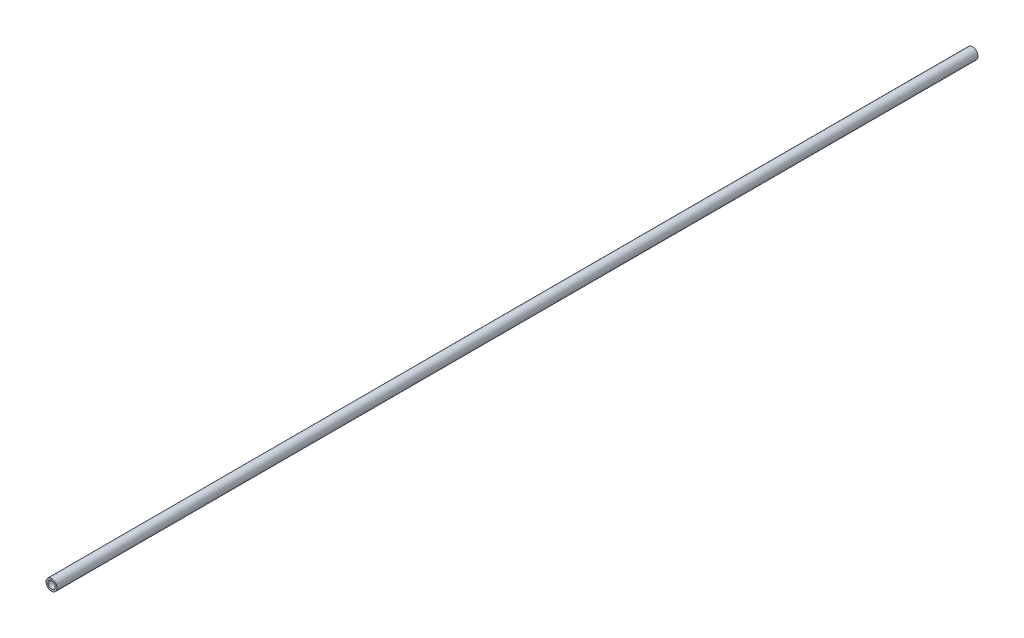
ISO-10303-21;
HEADER;
FILE_DESCRIPTION(('STEP AP214'),'2;1');
FILE_NAME('part.step','',(''),(''),'','','');
FILE_SCHEMA(('AUTOMOTIVE_DESIGN { 1 0 10303 214 1 1 1 1 }'));
ENDSEC;
DATA;
#1=APPLICATION_CONTEXT('core data for automotive mechanical design processes');
#2=APPLICATION_PROTOCOL_DEFINITION('international standard','automotive_design',2000,#1);
#3=PRODUCT_CONTEXT('',#1,'mechanical');
#4=PRODUCT('Part','Part','',(#3));
#5=PRODUCT_RELATED_PRODUCT_CATEGORY('part','',(#4));
#6=PRODUCT_DEFINITION_FORMATION('','',#4);
#7=PRODUCT_DEFINITION_CONTEXT('part definition',#1,'design');
#8=PRODUCT_DEFINITION('design','',#6,#7);
#9=PRODUCT_DEFINITION_SHAPE('','',#8);
#10=(LENGTH_UNIT() NAMED_UNIT(*) SI_UNIT(.MILLI.,.METRE.));
#11=(NAMED_UNIT(*) PLANE_ANGLE_UNIT() SI_UNIT($,.RADIAN.));
#12=(NAMED_UNIT(*) SI_UNIT($,.STERADIAN.) SOLID_ANGLE_UNIT());
#13=UNCERTAINTY_MEASURE_WITH_UNIT(LENGTH_MEASURE(1.E-05),#10,'distance_accuracy_value','');
#14=(GEOMETRIC_REPRESENTATION_CONTEXT(3) GLOBAL_UNCERTAINTY_ASSIGNED_CONTEXT((#13)) GLOBAL_UNIT_ASSIGNED_CONTEXT((#10,
#11,#12)) REPRESENTATION_CONTEXT('',''));
#15=CARTESIAN_POINT('',(0.,0.,0.));
#16=DIRECTION('',(0.,0.,1.));
#17=DIRECTION('',(1.,0.,0.));
#18=AXIS2_PLACEMENT_3D('',#15,#16,#17);
#19=CARTESIAN_POINT('',(0.,0.,500.));
#20=DIRECTION('',(0.,0.,1.));
#21=DIRECTION('',(1.,0.,0.));
#22=AXIS2_PLACEMENT_3D('',#19,#20,#21);
#23=PLANE('',#22);
#24=CARTESIAN_POINT('',(0.,0.,500.));
#25=DIRECTION('',(0.,0.,1.));
#26=DIRECTION('',(1.,0.,0.));
#27=AXIS2_PLACEMENT_3D('',#24,#25,#26);
#28=CIRCLE('',#27,3.);
#29=CARTESIAN_POINT('',(3.,0.,500.));
#30=VERTEX_POINT('',#29);
#31=EDGE_CURVE('E10',#30,#30,#28,.T.);
#32=ORIENTED_EDGE('',*,*,#31,.T.);
#33=EDGE_LOOP('',(#32));
#34=FACE_BOUND('',#33,.T.);
#35=CARTESIAN_POINT('',(0.,0.,500.));
#36=DIRECTION('',(0.,0.,1.));
#37=DIRECTION('',(1.,0.,0.));
#38=AXIS2_PLACEMENT_3D('',#35,#36,#37);
#39=CIRCLE('',#38,2.);
#40=CARTESIAN_POINT('',(2.,0.,500.));
#41=VERTEX_POINT('',#40);
#42=EDGE_CURVE('E42',#41,#41,#39,.T.);
#43=ORIENTED_EDGE('',*,*,#42,.F.);
#44=EDGE_LOOP('',(#43));
#45=FACE_BOUND('',#44,.T.);
#46=ADVANCED_FACE('F31',(#34,#45),#23,.T.);
#47=CARTESIAN_POINT('',(0.,0.,0.));
#48=DIRECTION('',(0.,0.,1.));
#49=DIRECTION('',(1.,0.,0.));
#50=AXIS2_PLACEMENT_3D('',#47,#48,#49);
#51=PLANE('',#50);
#52=CARTESIAN_POINT('',(0.,0.,0.));
#53=DIRECTION('',(0.,0.,1.));
#54=DIRECTION('',(1.,0.,0.));
#55=AXIS2_PLACEMENT_3D('',#52,#53,#54);
#56=CIRCLE('',#55,3.);
#57=CARTESIAN_POINT('',(3.,0.,0.));
#58=VERTEX_POINT('',#57);
#59=EDGE_CURVE('E35',#58,#58,#56,.T.);
#60=ORIENTED_EDGE('',*,*,#59,.F.);
#61=EDGE_LOOP('',(#60));
#62=FACE_BOUND('',#61,.T.);
#63=CARTESIAN_POINT('',(0.,0.,0.));
#64=DIRECTION('',(0.,0.,1.));
#65=DIRECTION('',(1.,0.,0.));
#66=AXIS2_PLACEMENT_3D('',#63,#64,#65);
#67=CIRCLE('',#66,2.);
#68=CARTESIAN_POINT('',(2.,0.,0.));
#69=VERTEX_POINT('',#68);
#70=EDGE_CURVE('E44',#69,#69,#67,.T.);
#71=ORIENTED_EDGE('',*,*,#70,.T.);
#72=EDGE_LOOP('',(#71));
#73=FACE_BOUND('',#72,.T.);
#74=ADVANCED_FACE('F54',(#62,#73),#51,.F.);
#75=CARTESIAN_POINT('',(0.,0.,500.));
#76=DIRECTION('',(0.,0.,-1.));
#77=DIRECTION('',(-1.,0.,0.));
#78=AXIS2_PLACEMENT_3D('',#75,#76,#77);
#79=CYLINDRICAL_SURFACE('',#78,3.);
#80=ORIENTED_EDGE('',*,*,#31,.F.);
#81=EDGE_LOOP('',(#80));
#82=FACE_BOUND('',#81,.T.);
#83=ORIENTED_EDGE('',*,*,#59,.T.);
#84=EDGE_LOOP('',(#83));
#85=FACE_BOUND('',#84,.T.);
#86=ADVANCED_FACE('F33',(#82,#85),#79,.T.);
#87=CARTESIAN_POINT('',(0.,0.,500.));
#88=DIRECTION('',(0.,0.,-1.));
#89=DIRECTION('',(-1.,0.,0.));
#90=AXIS2_PLACEMENT_3D('',#87,#88,#89);
#91=CYLINDRICAL_SURFACE('',#90,2.);
#92=ORIENTED_EDGE('',*,*,#42,.T.);
#93=EDGE_LOOP('',(#92));
#94=FACE_BOUND('',#93,.T.);
#95=ORIENTED_EDGE('',*,*,#70,.F.);
#96=EDGE_LOOP('',(#95));
#97=FACE_BOUND('',#96,.T.);
#98=ADVANCED_FACE('F50',(#94,#97),#91,.F.);
#99=CLOSED_SHELL('',(#46,#74,#86,#98));
#100=MANIFOLD_SOLID_BREP('B2',#99);
#101=ADVANCED_BREP_SHAPE_REPRESENTATION('',(#18,#100),#14);
#102=SHAPE_DEFINITION_REPRESENTATION(#9,#101);
ENDSEC;
END-ISO-10303-21;
